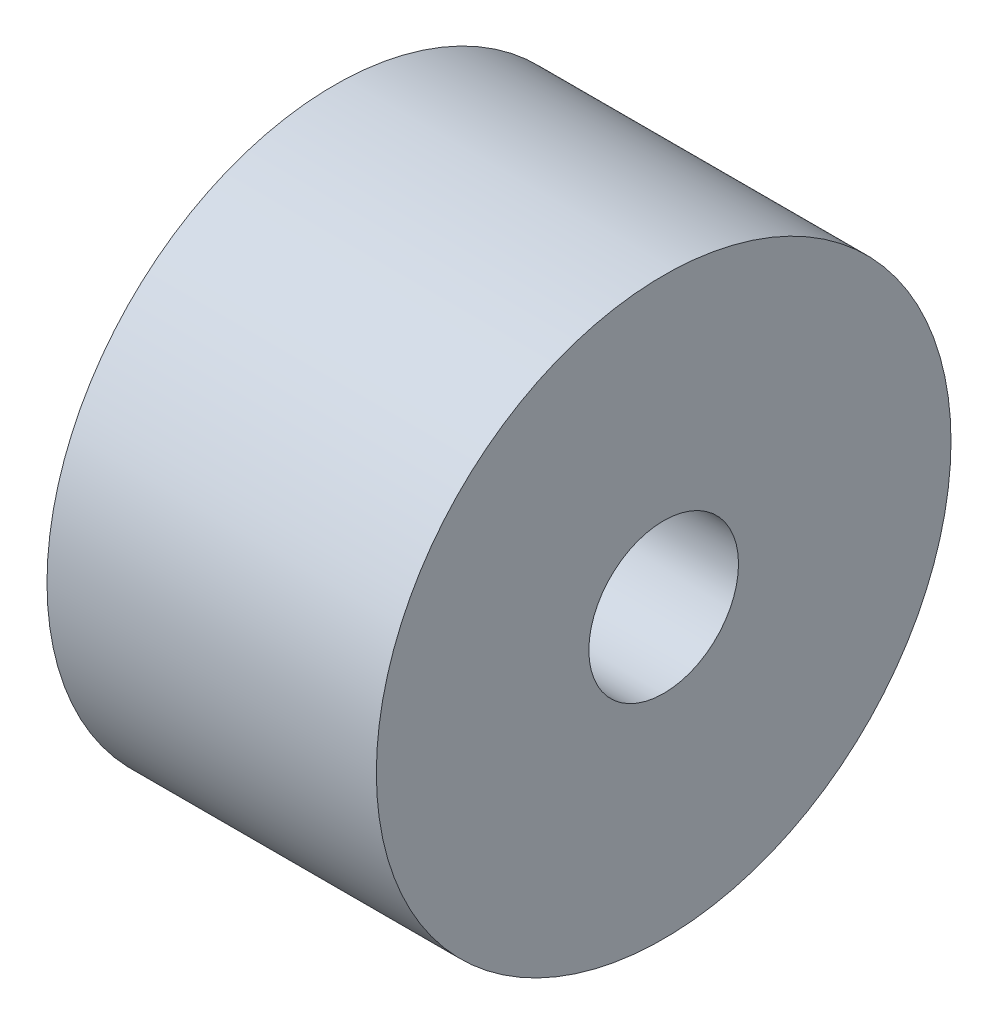
ISO-10303-21;
HEADER;
FILE_DESCRIPTION(('STEP AP214'),'2;1');
FILE_NAME('part.step','',(''),(''),'','','');
FILE_SCHEMA(('AUTOMOTIVE_DESIGN { 1 0 10303 214 1 1 1 1 }'));
ENDSEC;
DATA;
#1=APPLICATION_CONTEXT('core data for automotive mechanical design processes');
#2=APPLICATION_PROTOCOL_DEFINITION('international standard','automotive_design',2000,#1);
#3=PRODUCT_CONTEXT('',#1,'mechanical');
#4=PRODUCT('Part','Part','',(#3));
#5=PRODUCT_RELATED_PRODUCT_CATEGORY('part','',(#4));
#6=PRODUCT_DEFINITION_FORMATION('','',#4);
#7=PRODUCT_DEFINITION_CONTEXT('part definition',#1,'design');
#8=PRODUCT_DEFINITION('design','',#6,#7);
#9=PRODUCT_DEFINITION_SHAPE('','',#8);
#10=(LENGTH_UNIT() NAMED_UNIT(*) SI_UNIT(.MILLI.,.METRE.));
#11=(NAMED_UNIT(*) PLANE_ANGLE_UNIT() SI_UNIT($,.RADIAN.));
#12=(NAMED_UNIT(*) SI_UNIT($,.STERADIAN.) SOLID_ANGLE_UNIT());
#13=UNCERTAINTY_MEASURE_WITH_UNIT(LENGTH_MEASURE(1.E-05),#10,'distance_accuracy_value','');
#14=(GEOMETRIC_REPRESENTATION_CONTEXT(3) GLOBAL_UNCERTAINTY_ASSIGNED_CONTEXT((#13)) GLOBAL_UNIT_ASSIGNED_CONTEXT((#10,
#11,#12)) REPRESENTATION_CONTEXT('',''));
#15=CARTESIAN_POINT('',(0.,0.,0.));
#16=DIRECTION('',(0.,0.,1.));
#17=DIRECTION('',(1.,0.,0.));
#18=AXIS2_PLACEMENT_3D('',#15,#16,#17);
#19=CARTESIAN_POINT('',(-49.4934002594435,0.,0.));
#20=DIRECTION('',(-1.,0.,0.));
#21=DIRECTION('',(0.,0.,1.));
#22=AXIS2_PLACEMENT_3D('',#19,#20,#21);
#23=PLANE('',#22);
#24=CARTESIAN_POINT('',(-49.4934002594435,0.,0.));
#25=DIRECTION('',(1.,0.,0.));
#26=DIRECTION('',(0.,0.,-1.));
#27=AXIS2_PLACEMENT_3D('',#24,#25,#26);
#28=CIRCLE('',#27,1.25);
#29=CARTESIAN_POINT('',(-49.4934002594435,0.,-1.25000000000003));
#30=VERTEX_POINT('',#29);
#31=EDGE_CURVE('E58',#30,#30,#28,.F.);
#32=ORIENTED_EDGE('',*,*,#31,.T.);
#33=EDGE_LOOP('',(#32));
#34=FACE_BOUND('',#33,.T.);
#35=CARTESIAN_POINT('',(-49.4934002594435,0.,0.));
#36=DIRECTION('',(1.,0.,0.));
#37=DIRECTION('',(0.,0.,-1.));
#38=AXIS2_PLACEMENT_3D('',#35,#36,#37);
#39=CIRCLE('',#38,4.8);
#40=CARTESIAN_POINT('',(-49.4934002594435,0.,-4.80000000000003));
#41=VERTEX_POINT('',#40);
#42=EDGE_CURVE('E10',#41,#41,#39,.F.);
#43=ORIENTED_EDGE('',*,*,#42,.F.);
#44=EDGE_LOOP('',(#43));
#45=FACE_BOUND('',#44,.T.);
#46=ADVANCED_FACE('F37',(#34,#45),#23,.F.);
#47=CARTESIAN_POINT('',(-51.9953060919308,0.,0.));
#48=DIRECTION('',(-1.,0.,0.));
#49=DIRECTION('',(0.,0.,1.));
#50=AXIS2_PLACEMENT_3D('',#47,#48,#49);
#51=CYLINDRICAL_SURFACE('',#50,4.);
#52=CARTESIAN_POINT('',(-51.9953060919308,0.,0.));
#53=DIRECTION('',(-1.,0.,0.));
#54=DIRECTION('',(0.,0.,1.));
#55=AXIS2_PLACEMENT_3D('',#52,#53,#54);
#56=CIRCLE('',#55,4.);
#57=CARTESIAN_POINT('',(-51.9953060919308,0.,3.99999999999997));
#58=VERTEX_POINT('',#57);
#59=EDGE_CURVE('E48',#58,#58,#56,.T.);
#60=ORIENTED_EDGE('',*,*,#59,.F.);
#61=EDGE_LOOP('',(#60));
#62=FACE_BOUND('',#61,.T.);
#63=CARTESIAN_POINT('',(-54.9953060919308,0.,0.));
#64=DIRECTION('',(-1.,0.,0.));
#65=DIRECTION('',(0.,0.,1.));
#66=AXIS2_PLACEMENT_3D('',#63,#64,#65);
#67=CIRCLE('',#66,4.);
#68=CARTESIAN_POINT('',(-54.9953060919308,0.,3.99999999999997));
#69=VERTEX_POINT('',#68);
#70=EDGE_CURVE('E52',#69,#69,#67,.T.);
#71=ORIENTED_EDGE('',*,*,#70,.T.);
#72=EDGE_LOOP('',(#71));
#73=FACE_BOUND('',#72,.T.);
#74=ADVANCED_FACE('F70',(#62,#73),#51,.F.);
#75=CARTESIAN_POINT('',(-51.9953060919308,0.,0.));
#76=DIRECTION('',(-1.,0.,0.));
#77=DIRECTION('',(0.,0.,1.));
#78=AXIS2_PLACEMENT_3D('',#75,#76,#77);
#79=PLANE('',#78);
#80=CARTESIAN_POINT('',(-51.9953060919308,0.,0.));
#81=DIRECTION('',(-1.,0.,0.));
#82=DIRECTION('',(0.,0.,1.));
#83=AXIS2_PLACEMENT_3D('',#80,#81,#82);
#84=CIRCLE('',#83,1.25);
#85=CARTESIAN_POINT('',(-51.9953060919308,0.,1.24999999999997));
#86=VERTEX_POINT('',#85);
#87=EDGE_CURVE('E56',#86,#86,#84,.T.);
#88=ORIENTED_EDGE('',*,*,#87,.F.);
#89=EDGE_LOOP('',(#88));
#90=FACE_BOUND('',#89,.T.);
#91=ORIENTED_EDGE('',*,*,#59,.T.);
#92=EDGE_LOOP('',(#91));
#93=FACE_BOUND('',#92,.T.);
#94=ADVANCED_FACE('F67',(#90,#93),#79,.T.);
#95=CARTESIAN_POINT('',(-45.9578663535108,0.,0.));
#96=DIRECTION('',(-1.,0.,0.));
#97=DIRECTION('',(0.,0.,1.));
#98=AXIS2_PLACEMENT_3D('',#95,#96,#97);
#99=CYLINDRICAL_SURFACE('',#98,1.25);
#100=ORIENTED_EDGE('',*,*,#87,.T.);
#101=EDGE_LOOP('',(#100));
#102=FACE_BOUND('',#101,.T.);
#103=ORIENTED_EDGE('',*,*,#31,.F.);
#104=EDGE_LOOP('',(#103));
#105=FACE_BOUND('',#104,.T.);
#106=ADVANCED_FACE('F64',(#102,#105),#99,.F.);
#107=CARTESIAN_POINT('',(-54.9953060919308,0.,0.));
#108=DIRECTION('',(-1.,0.,0.));
#109=DIRECTION('',(0.,0.,1.));
#110=AXIS2_PLACEMENT_3D('',#107,#108,#109);
#111=PLANE('',#110);
#112=ORIENTED_EDGE('',*,*,#70,.F.);
#113=EDGE_LOOP('',(#112));
#114=FACE_BOUND('',#113,.T.);
#115=CARTESIAN_POINT('',(-54.9953060919308,0.,0.));
#116=DIRECTION('',(-1.,0.,0.));
#117=DIRECTION('',(0.,0.,1.));
#118=AXIS2_PLACEMENT_3D('',#115,#116,#117);
#119=CIRCLE('',#118,4.8);
#120=CARTESIAN_POINT('',(-54.9953060919308,0.,4.79999999999997));
#121=VERTEX_POINT('',#120);
#122=EDGE_CURVE('E44',#121,#121,#119,.T.);
#123=ORIENTED_EDGE('',*,*,#122,.T.);
#124=EDGE_LOOP('',(#123));
#125=FACE_BOUND('',#124,.T.);
#126=ADVANCED_FACE('F39',(#114,#125),#111,.T.);
#127=CARTESIAN_POINT('',(-35.3512646357125,0.,0.));
#128=DIRECTION('',(-1.,0.,0.));
#129=DIRECTION('',(0.,0.,1.));
#130=AXIS2_PLACEMENT_3D('',#127,#128,#129);
#131=CYLINDRICAL_SURFACE('',#130,4.8);
#132=ORIENTED_EDGE('',*,*,#122,.F.);
#133=EDGE_LOOP('',(#132));
#134=FACE_BOUND('',#133,.T.);
#135=ORIENTED_EDGE('',*,*,#42,.T.);
#136=EDGE_LOOP('',(#135));
#137=FACE_BOUND('',#136,.T.);
#138=ADVANCED_FACE('F80',(#134,#137),#131,.T.);
#139=CLOSED_SHELL('',(#46,#74,#94,#106,#126,#138));
#140=MANIFOLD_SOLID_BREP('B2',#139);
#141=ADVANCED_BREP_SHAPE_REPRESENTATION('',(#18,#140),#14);
#142=SHAPE_DEFINITION_REPRESENTATION(#9,#141);
ENDSEC;
END-ISO-10303-21;
